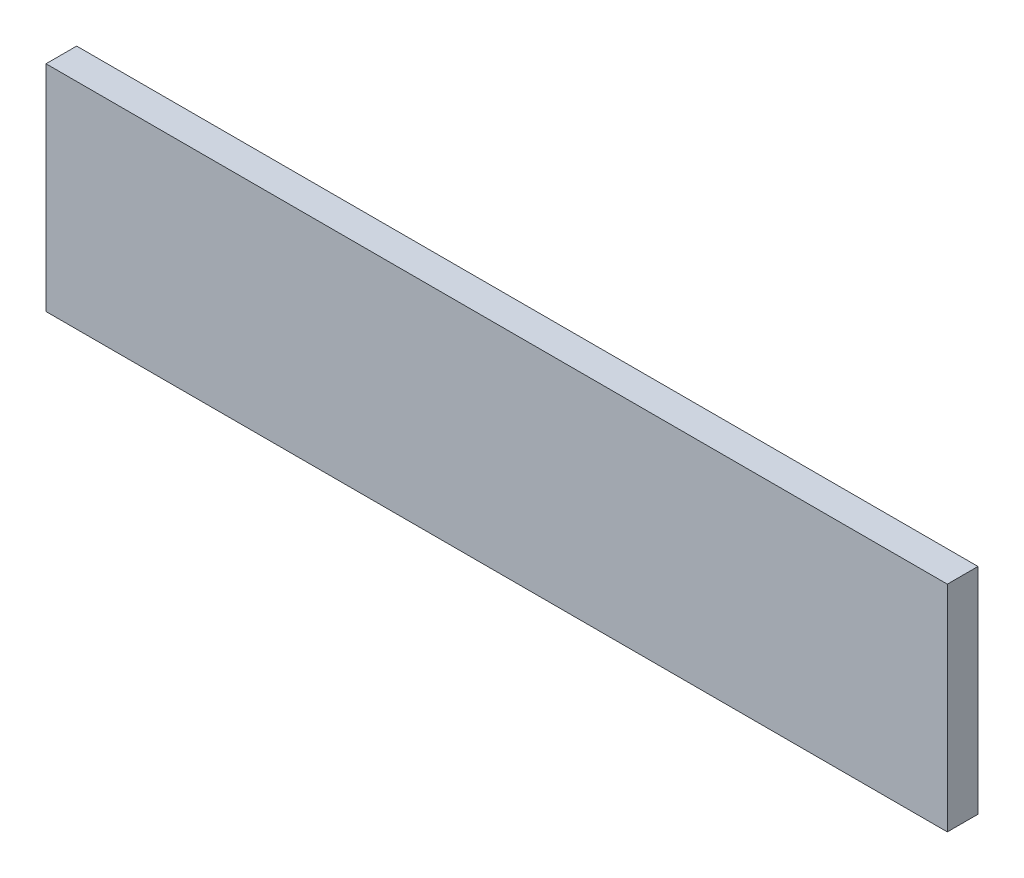
ISO-10303-21;
HEADER;
FILE_DESCRIPTION(('STEP AP214'),'2;1');
FILE_NAME('part.step','',(''),(''),'','','');
FILE_SCHEMA(('AUTOMOTIVE_DESIGN { 1 0 10303 214 1 1 1 1 }'));
ENDSEC;
DATA;
#1=APPLICATION_CONTEXT('core data for automotive mechanical design processes');
#2=APPLICATION_PROTOCOL_DEFINITION('international standard','automotive_design',2000,#1);
#3=PRODUCT_CONTEXT('',#1,'mechanical');
#4=PRODUCT('Part','Part','',(#3));
#5=PRODUCT_RELATED_PRODUCT_CATEGORY('part','',(#4));
#6=PRODUCT_DEFINITION_FORMATION('','',#4);
#7=PRODUCT_DEFINITION_CONTEXT('part definition',#1,'design');
#8=PRODUCT_DEFINITION('design','',#6,#7);
#9=PRODUCT_DEFINITION_SHAPE('','',#8);
#10=(LENGTH_UNIT() NAMED_UNIT(*) SI_UNIT(.MILLI.,.METRE.));
#11=(NAMED_UNIT(*) PLANE_ANGLE_UNIT() SI_UNIT($,.RADIAN.));
#12=(NAMED_UNIT(*) SI_UNIT($,.STERADIAN.) SOLID_ANGLE_UNIT());
#13=UNCERTAINTY_MEASURE_WITH_UNIT(LENGTH_MEASURE(1.E-05),#10,'distance_accuracy_value','');
#14=(GEOMETRIC_REPRESENTATION_CONTEXT(3) GLOBAL_UNCERTAINTY_ASSIGNED_CONTEXT((#13)) GLOBAL_UNIT_ASSIGNED_CONTEXT((#10,
#11,#12)) REPRESENTATION_CONTEXT('',''));
#15=CARTESIAN_POINT('',(0.,0.,0.));
#16=DIRECTION('',(0.,0.,1.));
#17=DIRECTION('',(1.,0.,0.));
#18=AXIS2_PLACEMENT_3D('',#15,#16,#17);
#19=CARTESIAN_POINT('',(-46.9999999999999,63.,10.));
#20=DIRECTION('',(1.,0.,0.));
#21=DIRECTION('',(0.,1.,0.));
#22=AXIS2_PLACEMENT_3D('',#19,#20,#21);
#23=PLANE('',#22);
#24=DIRECTION('',(0.,-1.,0.));
#25=VECTOR('',#24,1.);
#26=CARTESIAN_POINT('',(-46.9999999999999,63.,0.));
#27=LINE('',#26,#25);
#28=CARTESIAN_POINT('',(-46.9999999999999,63.,0.));
#29=VERTEX_POINT('',#28);
#30=CARTESIAN_POINT('',(-47.,-7.00000000000001,0.));
#31=VERTEX_POINT('',#30);
#32=EDGE_CURVE('E96',#29,#31,#27,.T.);
#33=ORIENTED_EDGE('',*,*,#32,.T.);
#34=DIRECTION('',(0.,0.,-1.));
#35=VECTOR('',#34,1.);
#36=CARTESIAN_POINT('',(-47.,-7.00000000000001,10.));
#37=LINE('',#36,#35);
#38=CARTESIAN_POINT('',(-47.,-7.00000000000001,10.));
#39=VERTEX_POINT('',#38);
#40=EDGE_CURVE('E11',#39,#31,#37,.T.);
#41=ORIENTED_EDGE('',*,*,#40,.F.);
#42=DIRECTION('',(0.,-1.,0.));
#43=VECTOR('',#42,1.);
#44=CARTESIAN_POINT('',(-46.9999999999999,63.,10.));
#45=LINE('',#44,#43);
#46=CARTESIAN_POINT('',(-46.9999999999999,63.,10.));
#47=VERTEX_POINT('',#46);
#48=EDGE_CURVE('E84',#47,#39,#45,.T.);
#49=ORIENTED_EDGE('',*,*,#48,.F.);
#50=DIRECTION('',(0.,0.,-1.));
#51=VECTOR('',#50,1.);
#52=CARTESIAN_POINT('',(-46.9999999999999,63.,10.));
#53=LINE('',#52,#51);
#54=EDGE_CURVE('E92',#47,#29,#53,.T.);
#55=ORIENTED_EDGE('',*,*,#54,.T.);
#56=EDGE_LOOP('',(#33,#41,#49,#55));
#57=FACE_BOUND('',#56,.T.);
#58=ADVANCED_FACE('F33',(#57),#23,.F.);
#59=CARTESIAN_POINT('',(-47.,-7.00000000000001,10.));
#60=DIRECTION('',(0.,1.,0.));
#61=DIRECTION('',(0.,0.,1.));
#62=AXIS2_PLACEMENT_3D('',#59,#60,#61);
#63=PLANE('',#62);
#64=DIRECTION('',(1.,0.,0.));
#65=VECTOR('',#64,1.);
#66=CARTESIAN_POINT('',(-47.,-7.00000000000001,0.));
#67=LINE('',#66,#65);
#68=CARTESIAN_POINT('',(247.,-7.00000000000001,0.));
#69=VERTEX_POINT('',#68);
#70=EDGE_CURVE('E88',#31,#69,#67,.T.);
#71=ORIENTED_EDGE('',*,*,#70,.T.);
#72=DIRECTION('',(0.,0.,-1.));
#73=VECTOR('',#72,1.);
#74=CARTESIAN_POINT('',(247.,-7.00000000000001,10.));
#75=LINE('',#74,#73);
#76=CARTESIAN_POINT('',(247.,-7.00000000000001,10.));
#77=VERTEX_POINT('',#76);
#78=EDGE_CURVE('E41',#77,#69,#75,.T.);
#79=ORIENTED_EDGE('',*,*,#78,.F.);
#80=DIRECTION('',(1.,0.,0.));
#81=VECTOR('',#80,1.);
#82=CARTESIAN_POINT('',(-47.,-7.00000000000001,10.));
#83=LINE('',#82,#81);
#84=EDGE_CURVE('E79',#39,#77,#83,.T.);
#85=ORIENTED_EDGE('',*,*,#84,.F.);
#86=ORIENTED_EDGE('',*,*,#40,.T.);
#87=EDGE_LOOP('',(#71,#79,#85,#86));
#88=FACE_BOUND('',#87,.T.);
#89=ADVANCED_FACE('F87',(#88),#63,.F.);
#90=CARTESIAN_POINT('',(247.,63.,10.));
#91=DIRECTION('',(-1.,0.,0.));
#92=DIRECTION('',(0.,-1.,0.));
#93=AXIS2_PLACEMENT_3D('',#90,#91,#92);
#94=PLANE('',#93);
#95=DIRECTION('',(0.,1.,0.));
#96=VECTOR('',#95,1.);
#97=CARTESIAN_POINT('',(247.,63.,0.));
#98=LINE('',#97,#96);
#99=CARTESIAN_POINT('',(247.,63.,0.));
#100=VERTEX_POINT('',#99);
#101=EDGE_CURVE('E66',#69,#100,#98,.T.);
#102=ORIENTED_EDGE('',*,*,#101,.T.);
#103=DIRECTION('',(0.,0.,-1.));
#104=VECTOR('',#103,1.);
#105=CARTESIAN_POINT('',(247.,63.,10.));
#106=LINE('',#105,#104);
#107=CARTESIAN_POINT('',(247.,63.,10.));
#108=VERTEX_POINT('',#107);
#109=EDGE_CURVE('E89',#108,#100,#106,.T.);
#110=ORIENTED_EDGE('',*,*,#109,.F.);
#111=DIRECTION('',(0.,1.,0.));
#112=VECTOR('',#111,1.);
#113=CARTESIAN_POINT('',(247.,63.,10.));
#114=LINE('',#113,#112);
#115=EDGE_CURVE('E82',#77,#108,#114,.T.);
#116=ORIENTED_EDGE('',*,*,#115,.F.);
#117=ORIENTED_EDGE('',*,*,#78,.T.);
#118=EDGE_LOOP('',(#102,#110,#116,#117));
#119=FACE_BOUND('',#118,.T.);
#120=ADVANCED_FACE('F90',(#119),#94,.F.);
#121=CARTESIAN_POINT('',(-46.9999999999999,63.,10.));
#122=DIRECTION('',(0.,-1.,0.));
#123=DIRECTION('',(0.,0.,-1.));
#124=AXIS2_PLACEMENT_3D('',#121,#122,#123);
#125=PLANE('',#124);
#126=DIRECTION('',(-1.,0.,0.));
#127=VECTOR('',#126,1.);
#128=CARTESIAN_POINT('',(-46.9999999999999,63.,0.));
#129=LINE('',#128,#127);
#130=EDGE_CURVE('E72',#100,#29,#129,.T.);
#131=ORIENTED_EDGE('',*,*,#130,.T.);
#132=ORIENTED_EDGE('',*,*,#54,.F.);
#133=DIRECTION('',(-1.,0.,0.));
#134=VECTOR('',#133,1.);
#135=CARTESIAN_POINT('',(-46.9999999999999,63.,10.));
#136=LINE('',#135,#134);
#137=EDGE_CURVE('E49',#108,#47,#136,.T.);
#138=ORIENTED_EDGE('',*,*,#137,.F.);
#139=ORIENTED_EDGE('',*,*,#109,.T.);
#140=EDGE_LOOP('',(#131,#132,#138,#139));
#141=FACE_BOUND('',#140,.T.);
#142=ADVANCED_FACE('F103',(#141),#125,.F.);
#143=CARTESIAN_POINT('',(0.,0.,10.));
#144=DIRECTION('',(0.,0.,1.));
#145=DIRECTION('',(1.,0.,0.));
#146=AXIS2_PLACEMENT_3D('',#143,#144,#145);
#147=PLANE('',#146);
#148=ORIENTED_EDGE('',*,*,#48,.T.);
#149=ORIENTED_EDGE('',*,*,#84,.T.);
#150=ORIENTED_EDGE('',*,*,#115,.T.);
#151=ORIENTED_EDGE('',*,*,#137,.T.);
#152=EDGE_LOOP('',(#148,#149,#150,#151));
#153=FACE_BOUND('',#152,.T.);
#154=ADVANCED_FACE('F80',(#153),#147,.T.);
#155=CARTESIAN_POINT('',(0.,0.,0.));
#156=DIRECTION('',(0.,0.,1.));
#157=DIRECTION('',(1.,0.,0.));
#158=AXIS2_PLACEMENT_3D('',#155,#156,#157);
#159=PLANE('',#158);
#160=ORIENTED_EDGE('',*,*,#32,.F.);
#161=ORIENTED_EDGE('',*,*,#130,.F.);
#162=ORIENTED_EDGE('',*,*,#101,.F.);
#163=ORIENTED_EDGE('',*,*,#70,.F.);
#164=EDGE_LOOP('',(#160,#161,#162,#163));
#165=FACE_BOUND('',#164,.T.);
#166=ADVANCED_FACE('F106',(#165),#159,.F.);
#167=CLOSED_SHELL('',(#58,#89,#120,#142,#154,#166));
#168=MANIFOLD_SOLID_BREP('B2',#167);
#169=ADVANCED_BREP_SHAPE_REPRESENTATION('',(#18,#168),#14);
#170=SHAPE_DEFINITION_REPRESENTATION(#9,#169);
ENDSEC;
END-ISO-10303-21;
